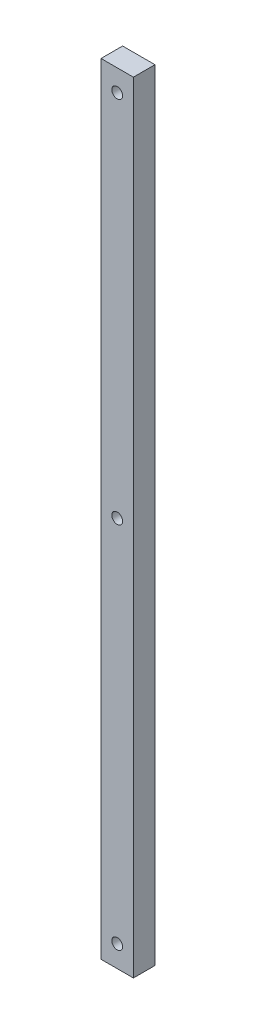
ISO-10303-21;
HEADER;
FILE_DESCRIPTION(('STEP AP214'),'2;1');
FILE_NAME('part.step','',(''),(''),'','','');
FILE_SCHEMA(('AUTOMOTIVE_DESIGN { 1 0 10303 214 1 1 1 1 }'));
ENDSEC;
DATA;
#1=APPLICATION_CONTEXT('core data for automotive mechanical design processes');
#2=APPLICATION_PROTOCOL_DEFINITION('international standard','automotive_design',2000,#1);
#3=PRODUCT_CONTEXT('',#1,'mechanical');
#4=PRODUCT('Part','Part','',(#3));
#5=PRODUCT_RELATED_PRODUCT_CATEGORY('part','',(#4));
#6=PRODUCT_DEFINITION_FORMATION('','',#4);
#7=PRODUCT_DEFINITION_CONTEXT('part definition',#1,'design');
#8=PRODUCT_DEFINITION('design','',#6,#7);
#9=PRODUCT_DEFINITION_SHAPE('','',#8);
#10=(LENGTH_UNIT() NAMED_UNIT(*) SI_UNIT(.MILLI.,.METRE.));
#11=(NAMED_UNIT(*) PLANE_ANGLE_UNIT() SI_UNIT($,.RADIAN.));
#12=(NAMED_UNIT(*) SI_UNIT($,.STERADIAN.) SOLID_ANGLE_UNIT());
#13=UNCERTAINTY_MEASURE_WITH_UNIT(LENGTH_MEASURE(1.E-05),#10,'distance_accuracy_value','');
#14=(GEOMETRIC_REPRESENTATION_CONTEXT(3) GLOBAL_UNCERTAINTY_ASSIGNED_CONTEXT((#13)) GLOBAL_UNIT_ASSIGNED_CONTEXT((#10,
#11,#12)) REPRESENTATION_CONTEXT('',''));
#15=CARTESIAN_POINT('',(0.,0.,0.));
#16=DIRECTION('',(0.,0.,1.));
#17=DIRECTION('',(1.,0.,0.));
#18=AXIS2_PLACEMENT_3D('',#15,#16,#17);
#19=CARTESIAN_POINT('',(-159.791666666667,723.,-19.5833333333333));
#20=DIRECTION('',(1.,0.,0.));
#21=DIRECTION('',(0.,0.,-1.));
#22=AXIS2_PLACEMENT_3D('',#19,#20,#21);
#23=PLANE('',#22);
#24=DIRECTION('',(0.,0.,1.));
#25=VECTOR('',#24,1.);
#26=CARTESIAN_POINT('',(-159.791666666667,0.,-19.5833333333333));
#27=LINE('',#26,#25);
#28=CARTESIAN_POINT('',(-159.791666666667,0.,-19.5833333333333));
#29=VERTEX_POINT('',#28);
#30=CARTESIAN_POINT('',(-159.791666666667,0.,0.416666666666652));
#31=VERTEX_POINT('',#30);
#32=EDGE_CURVE('E116',#29,#31,#27,.T.);
#33=ORIENTED_EDGE('',*,*,#32,.T.);
#34=DIRECTION('',(0.,-1.,0.));
#35=VECTOR('',#34,1.);
#36=CARTESIAN_POINT('',(-159.791666666667,723.,0.416666666666652));
#37=LINE('',#36,#35);
#38=CARTESIAN_POINT('',(-159.791666666667,723.,0.416666666666652));
#39=VERTEX_POINT('',#38);
#40=EDGE_CURVE('E12',#39,#31,#37,.T.);
#41=ORIENTED_EDGE('',*,*,#40,.F.);
#42=DIRECTION('',(0.,0.,1.));
#43=VECTOR('',#42,1.);
#44=CARTESIAN_POINT('',(-159.791666666667,723.,-19.5833333333333));
#45=LINE('',#44,#43);
#46=CARTESIAN_POINT('',(-159.791666666667,723.,-19.5833333333333));
#47=VERTEX_POINT('',#46);
#48=EDGE_CURVE('E103',#47,#39,#45,.T.);
#49=ORIENTED_EDGE('',*,*,#48,.F.);
#50=DIRECTION('',(0.,-1.,0.));
#51=VECTOR('',#50,1.);
#52=CARTESIAN_POINT('',(-159.791666666667,723.,-19.5833333333333));
#53=LINE('',#52,#51);
#54=EDGE_CURVE('E112',#47,#29,#53,.T.);
#55=ORIENTED_EDGE('',*,*,#54,.T.);
#56=EDGE_LOOP('',(#33,#41,#49,#55));
#57=FACE_BOUND('',#56,.T.);
#58=ADVANCED_FACE('F50',(#57),#23,.F.);
#59=CARTESIAN_POINT('',(-159.791666666667,723.,0.416666666666652));
#60=DIRECTION('',(0.,0.,-1.));
#61=DIRECTION('',(-1.,0.,0.));
#62=AXIS2_PLACEMENT_3D('',#59,#60,#61);
#63=PLANE('',#62);
#64=CARTESIAN_POINT('',(-144.791666666667,703.,0.416666666666652));
#65=DIRECTION('',(0.,0.,1.));
#66=DIRECTION('',(1.,0.,0.));
#67=AXIS2_PLACEMENT_3D('',#64,#65,#66);
#68=CIRCLE('',#67,5.00000000000002);
#69=CARTESIAN_POINT('',(-139.791666666667,703.,0.416666666666652));
#70=VERTEX_POINT('',#69);
#71=EDGE_CURVE('E127',#70,#70,#68,.T.);
#72=ORIENTED_EDGE('',*,*,#71,.F.);
#73=EDGE_LOOP('',(#72));
#74=FACE_BOUND('',#73,.T.);
#75=CARTESIAN_POINT('',(-144.791666666667,361.5,0.416666666666652));
#76=DIRECTION('',(0.,0.,1.));
#77=DIRECTION('',(1.,0.,0.));
#78=AXIS2_PLACEMENT_3D('',#75,#76,#77);
#79=CIRCLE('',#78,5.00000000000002);
#80=CARTESIAN_POINT('',(-139.791666666667,361.5,0.416666666666652));
#81=VERTEX_POINT('',#80);
#82=EDGE_CURVE('E225',#81,#81,#79,.T.);
#83=ORIENTED_EDGE('',*,*,#82,.F.);
#84=EDGE_LOOP('',(#83));
#85=FACE_BOUND('',#84,.T.);
#86=CARTESIAN_POINT('',(-144.791666666667,20.,0.416666666666652));
#87=DIRECTION('',(0.,0.,1.));
#88=DIRECTION('',(1.,0.,0.));
#89=AXIS2_PLACEMENT_3D('',#86,#87,#88);
#90=CIRCLE('',#89,4.99999999999999);
#91=CARTESIAN_POINT('',(-139.791666666667,20.,0.416666666666652));
#92=VERTEX_POINT('',#91);
#93=EDGE_CURVE('E221',#92,#92,#90,.T.);
#94=ORIENTED_EDGE('',*,*,#93,.F.);
#95=EDGE_LOOP('',(#94));
#96=FACE_BOUND('',#95,.T.);
#97=DIRECTION('',(1.,0.,0.));
#98=VECTOR('',#97,1.);
#99=CARTESIAN_POINT('',(-159.791666666667,0.,0.416666666666652));
#100=LINE('',#99,#98);
#101=CARTESIAN_POINT('',(-129.791666666667,0.,0.416666666666652));
#102=VERTEX_POINT('',#101);
#103=EDGE_CURVE('E107',#31,#102,#100,.T.);
#104=ORIENTED_EDGE('',*,*,#103,.T.);
#105=DIRECTION('',(0.,-1.,0.));
#106=VECTOR('',#105,1.);
#107=CARTESIAN_POINT('',(-129.791666666667,723.,0.416666666666652));
#108=LINE('',#107,#106);
#109=CARTESIAN_POINT('',(-129.791666666667,723.,0.416666666666652));
#110=VERTEX_POINT('',#109);
#111=EDGE_CURVE('E59',#110,#102,#108,.T.);
#112=ORIENTED_EDGE('',*,*,#111,.F.);
#113=DIRECTION('',(1.,0.,0.));
#114=VECTOR('',#113,1.);
#115=CARTESIAN_POINT('',(-159.791666666667,723.,0.416666666666652));
#116=LINE('',#115,#114);
#117=EDGE_CURVE('E98',#39,#110,#116,.T.);
#118=ORIENTED_EDGE('',*,*,#117,.F.);
#119=ORIENTED_EDGE('',*,*,#40,.T.);
#120=EDGE_LOOP('',(#104,#112,#118,#119));
#121=FACE_BOUND('',#120,.T.);
#122=ADVANCED_FACE('F106',(#74,#85,#96,#121),#63,.F.);
#123=CARTESIAN_POINT('',(-129.791666666667,723.,-19.5833333333333));
#124=DIRECTION('',(-1.,0.,0.));
#125=DIRECTION('',(0.,0.,1.));
#126=AXIS2_PLACEMENT_3D('',#123,#124,#125);
#127=PLANE('',#126);
#128=DIRECTION('',(0.,0.,-1.));
#129=VECTOR('',#128,1.);
#130=CARTESIAN_POINT('',(-129.791666666667,0.,-19.5833333333333));
#131=LINE('',#130,#129);
#132=CARTESIAN_POINT('',(-129.791666666667,0.,-19.5833333333333));
#133=VERTEX_POINT('',#132);
#134=EDGE_CURVE('E85',#102,#133,#131,.T.);
#135=ORIENTED_EDGE('',*,*,#134,.T.);
#136=DIRECTION('',(0.,-1.,0.));
#137=VECTOR('',#136,1.);
#138=CARTESIAN_POINT('',(-129.791666666667,723.,-19.5833333333333));
#139=LINE('',#138,#137);
#140=CARTESIAN_POINT('',(-129.791666666667,723.,-19.5833333333333));
#141=VERTEX_POINT('',#140);
#142=EDGE_CURVE('E108',#141,#133,#139,.T.);
#143=ORIENTED_EDGE('',*,*,#142,.F.);
#144=DIRECTION('',(0.,0.,-1.));
#145=VECTOR('',#144,1.);
#146=CARTESIAN_POINT('',(-129.791666666667,723.,-19.5833333333333));
#147=LINE('',#146,#145);
#148=EDGE_CURVE('E101',#110,#141,#147,.T.);
#149=ORIENTED_EDGE('',*,*,#148,.F.);
#150=ORIENTED_EDGE('',*,*,#111,.T.);
#151=EDGE_LOOP('',(#135,#143,#149,#150));
#152=FACE_BOUND('',#151,.T.);
#153=ADVANCED_FACE('F110',(#152),#127,.F.);
#154=CARTESIAN_POINT('',(-159.791666666667,723.,-19.5833333333333));
#155=DIRECTION('',(0.,0.,1.));
#156=DIRECTION('',(1.,0.,0.));
#157=AXIS2_PLACEMENT_3D('',#154,#155,#156);
#158=PLANE('',#157);
#159=CARTESIAN_POINT('',(-144.791666666667,703.,-19.5833333333333));
#160=DIRECTION('',(0.,0.,1.));
#161=DIRECTION('',(1.,0.,0.));
#162=AXIS2_PLACEMENT_3D('',#159,#160,#161);
#163=CIRCLE('',#162,5.00000000000002);
#164=CARTESIAN_POINT('',(-139.791666666667,703.,-19.5833333333333));
#165=VERTEX_POINT('',#164);
#166=EDGE_CURVE('E53',#165,#165,#163,.T.);
#167=ORIENTED_EDGE('',*,*,#166,.T.);
#168=EDGE_LOOP('',(#167));
#169=FACE_BOUND('',#168,.T.);
#170=CARTESIAN_POINT('',(-144.791666666667,361.5,-19.5833333333333));
#171=DIRECTION('',(0.,0.,1.));
#172=DIRECTION('',(1.,0.,0.));
#173=AXIS2_PLACEMENT_3D('',#170,#171,#172);
#174=CIRCLE('',#173,5.00000000000002);
#175=CARTESIAN_POINT('',(-139.791666666667,361.5,-19.5833333333333));
#176=VERTEX_POINT('',#175);
#177=EDGE_CURVE('E126',#176,#176,#174,.T.);
#178=ORIENTED_EDGE('',*,*,#177,.T.);
#179=EDGE_LOOP('',(#178));
#180=FACE_BOUND('',#179,.T.);
#181=CARTESIAN_POINT('',(-144.791666666667,20.,-19.5833333333333));
#182=DIRECTION('',(0.,0.,1.));
#183=DIRECTION('',(1.,0.,0.));
#184=AXIS2_PLACEMENT_3D('',#181,#182,#183);
#185=CIRCLE('',#184,4.99999999999999);
#186=CARTESIAN_POINT('',(-139.791666666667,20.,-19.5833333333333));
#187=VERTEX_POINT('',#186);
#188=EDGE_CURVE('E124',#187,#187,#185,.T.);
#189=ORIENTED_EDGE('',*,*,#188,.T.);
#190=EDGE_LOOP('',(#189));
#191=FACE_BOUND('',#190,.T.);
#192=DIRECTION('',(-1.,0.,0.));
#193=VECTOR('',#192,1.);
#194=CARTESIAN_POINT('',(-159.791666666667,0.,-19.5833333333333));
#195=LINE('',#194,#193);
#196=EDGE_CURVE('E91',#133,#29,#195,.T.);
#197=ORIENTED_EDGE('',*,*,#196,.T.);
#198=ORIENTED_EDGE('',*,*,#54,.F.);
#199=DIRECTION('',(-1.,0.,0.));
#200=VECTOR('',#199,1.);
#201=CARTESIAN_POINT('',(-159.791666666667,723.,-19.5833333333333));
#202=LINE('',#201,#200);
#203=EDGE_CURVE('E68',#141,#47,#202,.T.);
#204=ORIENTED_EDGE('',*,*,#203,.F.);
#205=ORIENTED_EDGE('',*,*,#142,.T.);
#206=EDGE_LOOP('',(#197,#198,#204,#205));
#207=FACE_BOUND('',#206,.T.);
#208=ADVANCED_FACE('F134',(#169,#180,#191,#207),#158,.F.);
#209=CARTESIAN_POINT('',(0.,723.,0.));
#210=DIRECTION('',(0.,1.,0.));
#211=DIRECTION('',(0.,0.,1.));
#212=AXIS2_PLACEMENT_3D('',#209,#210,#211);
#213=PLANE('',#212);
#214=ORIENTED_EDGE('',*,*,#48,.T.);
#215=ORIENTED_EDGE('',*,*,#117,.T.);
#216=ORIENTED_EDGE('',*,*,#148,.T.);
#217=ORIENTED_EDGE('',*,*,#203,.T.);
#218=EDGE_LOOP('',(#214,#215,#216,#217));
#219=FACE_BOUND('',#218,.T.);
#220=ADVANCED_FACE('F99',(#219),#213,.T.);
#221=CARTESIAN_POINT('',(0.,0.,0.));
#222=DIRECTION('',(0.,1.,0.));
#223=DIRECTION('',(0.,0.,1.));
#224=AXIS2_PLACEMENT_3D('',#221,#222,#223);
#225=PLANE('',#224);
#226=ORIENTED_EDGE('',*,*,#32,.F.);
#227=ORIENTED_EDGE('',*,*,#196,.F.);
#228=ORIENTED_EDGE('',*,*,#134,.F.);
#229=ORIENTED_EDGE('',*,*,#103,.F.);
#230=EDGE_LOOP('',(#226,#227,#228,#229));
#231=FACE_BOUND('',#230,.T.);
#232=ADVANCED_FACE('F157',(#231),#225,.F.);
#233=CARTESIAN_POINT('',(-144.791666666667,20.,-24.5833333333333));
#234=DIRECTION('',(0.,0.,1.));
#235=DIRECTION('',(1.,0.,0.));
#236=AXIS2_PLACEMENT_3D('',#233,#234,#235);
#237=CYLINDRICAL_SURFACE('',#236,4.99999999999999);
#238=ORIENTED_EDGE('',*,*,#93,.T.);
#239=EDGE_LOOP('',(#238));
#240=FACE_BOUND('',#239,.T.);
#241=ORIENTED_EDGE('',*,*,#188,.F.);
#242=EDGE_LOOP('',(#241));
#243=FACE_BOUND('',#242,.T.);
#244=ADVANCED_FACE('F144',(#240,#243),#237,.F.);
#245=CARTESIAN_POINT('',(-144.791666666667,361.5,-24.5833333333333));
#246=DIRECTION('',(0.,0.,1.));
#247=DIRECTION('',(1.,0.,0.));
#248=AXIS2_PLACEMENT_3D('',#245,#246,#247);
#249=CYLINDRICAL_SURFACE('',#248,5.00000000000002);
#250=ORIENTED_EDGE('',*,*,#82,.T.);
#251=EDGE_LOOP('',(#250));
#252=FACE_BOUND('',#251,.T.);
#253=ORIENTED_EDGE('',*,*,#177,.F.);
#254=EDGE_LOOP('',(#253));
#255=FACE_BOUND('',#254,.T.);
#256=ADVANCED_FACE('F138',(#252,#255),#249,.F.);
#257=CARTESIAN_POINT('',(-144.791666666667,703.,-24.5833333333333));
#258=DIRECTION('',(0.,0.,1.));
#259=DIRECTION('',(1.,0.,0.));
#260=AXIS2_PLACEMENT_3D('',#257,#258,#259);
#261=CYLINDRICAL_SURFACE('',#260,5.00000000000002);
#262=ORIENTED_EDGE('',*,*,#71,.T.);
#263=EDGE_LOOP('',(#262));
#264=FACE_BOUND('',#263,.T.);
#265=ORIENTED_EDGE('',*,*,#166,.F.);
#266=EDGE_LOOP('',(#265));
#267=FACE_BOUND('',#266,.T.);
#268=ADVANCED_FACE('F136',(#264,#267),#261,.F.);
#269=CLOSED_SHELL('',(#58,#122,#153,#208,#220,#232,#244,#256,#268));
#270=MANIFOLD_SOLID_BREP('B2',#269);
#271=ADVANCED_BREP_SHAPE_REPRESENTATION('',(#18,#270),#14);
#272=SHAPE_DEFINITION_REPRESENTATION(#9,#271);
ENDSEC;
END-ISO-10303-21;
